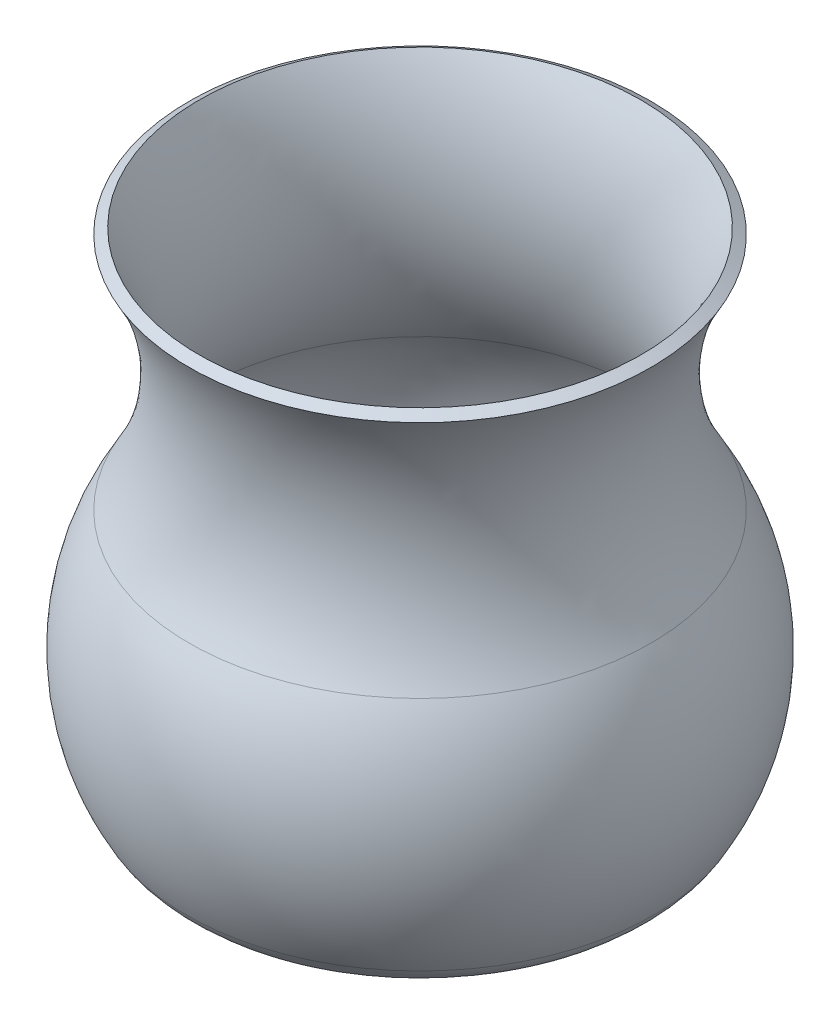
ISO-10303-21;
HEADER;
FILE_DESCRIPTION(('STEP AP214'),'2;1');
FILE_NAME('part.step','',(''),(''),'','','');
FILE_SCHEMA(('AUTOMOTIVE_DESIGN { 1 0 10303 214 1 1 1 1 }'));
ENDSEC;
DATA;
#1=APPLICATION_CONTEXT('core data for automotive mechanical design processes');
#2=APPLICATION_PROTOCOL_DEFINITION('international standard','automotive_design',2000,#1);
#3=PRODUCT_CONTEXT('',#1,'mechanical');
#4=PRODUCT('Part','Part','',(#3));
#5=PRODUCT_RELATED_PRODUCT_CATEGORY('part','',(#4));
#6=PRODUCT_DEFINITION_FORMATION('','',#4);
#7=PRODUCT_DEFINITION_CONTEXT('part definition',#1,'design');
#8=PRODUCT_DEFINITION('design','',#6,#7);
#9=PRODUCT_DEFINITION_SHAPE('','',#8);
#10=(LENGTH_UNIT() NAMED_UNIT(*) SI_UNIT(.MILLI.,.METRE.));
#11=(NAMED_UNIT(*) PLANE_ANGLE_UNIT() SI_UNIT($,.RADIAN.));
#12=(NAMED_UNIT(*) SI_UNIT($,.STERADIAN.) SOLID_ANGLE_UNIT());
#13=UNCERTAINTY_MEASURE_WITH_UNIT(LENGTH_MEASURE(1.E-05),#10,'distance_accuracy_value','');
#14=(GEOMETRIC_REPRESENTATION_CONTEXT(3) GLOBAL_UNCERTAINTY_ASSIGNED_CONTEXT((#13)) GLOBAL_UNIT_ASSIGNED_CONTEXT((#10,
#11,#12)) REPRESENTATION_CONTEXT('',''));
#15=CARTESIAN_POINT('',(0.,0.,0.));
#16=DIRECTION('',(0.,0.,1.));
#17=DIRECTION('',(1.,0.,0.));
#18=AXIS2_PLACEMENT_3D('',#15,#16,#17);
#19=CARTESIAN_POINT('',(0.,49.4766307069672,0.));
#20=DIRECTION('',(0.,-1.,0.));
#21=DIRECTION('',(0.,0.,-1.));
#22=AXIS2_PLACEMENT_3D('',#19,#20,#21);
#23=TOROIDAL_SURFACE('',#22,55.6714823450483,30.);
#24=CARTESIAN_POINT('',(0.,65.,0.));
#25=DIRECTION('',(0.,-1.,0.));
#26=DIRECTION('',(0.,0.,-1.));
#27=AXIS2_PLACEMENT_3D('',#24,#25,#26);
#28=CIRCLE('',#27,30.);
#29=CARTESIAN_POINT('',(0.,65.,-30.));
#30=VERTEX_POINT('',#29);
#31=EDGE_CURVE('E78',#30,#30,#28,.T.);
#32=ORIENTED_EDGE('',*,*,#31,.T.);
#33=EDGE_LOOP('',(#32));
#34=FACE_BOUND('',#33,.T.);
#35=CARTESIAN_POINT('',(0.,33.9532614139343,0.));
#36=DIRECTION('',(0.,-1.,0.));
#37=DIRECTION('',(0.,0.,-1.));
#38=AXIS2_PLACEMENT_3D('',#35,#36,#37);
#39=CIRCLE('',#38,30.);
#40=CARTESIAN_POINT('',(0.,33.9532614139343,-30.));
#41=VERTEX_POINT('',#40);
#42=EDGE_CURVE('E10',#41,#41,#39,.T.);
#43=ORIENTED_EDGE('',*,*,#42,.F.);
#44=EDGE_LOOP('',(#43));
#45=FACE_BOUND('',#44,.T.);
#46=ADVANCED_FACE('F43',(#34,#45),#23,.F.);
#47=CARTESIAN_POINT('',(0.,18.4298921209015,0.));
#48=DIRECTION('',(0.,-1.,0.));
#49=DIRECTION('',(0.,0.,-1.));
#50=AXIS2_PLACEMENT_3D('',#47,#48,#49);
#51=DEGENERATE_TOROIDAL_SURFACE('',#50,4.32851765495172,30.,.T.);
#52=ORIENTED_EDGE('',*,*,#42,.T.);
#53=EDGE_LOOP('',(#52));
#54=FACE_BOUND('',#53,.T.);
#55=CARTESIAN_POINT('',(0.,3.52133718059519,0.));
#56=DIRECTION('',(0.,-1.,0.));
#57=DIRECTION('',(0.,0.,-1.));
#58=AXIS2_PLACEMENT_3D('',#55,#56,#57);
#59=CIRCLE('',#58,30.3618614584639);
#60=CARTESIAN_POINT('',(0.,3.52133718059519,-30.3618614584639));
#61=VERTEX_POINT('',#60);
#62=EDGE_CURVE('E50',#61,#61,#59,.T.);
#63=ORIENTED_EDGE('',*,*,#62,.F.);
#64=EDGE_LOOP('',(#63));
#65=FACE_BOUND('',#64,.T.);
#66=ADVANCED_FACE('F120',(#54,#65),#51,.T.);
#67=CARTESIAN_POINT('',(0.,7.,0.));
#68=DIRECTION('',(0.,-1.,0.));
#69=DIRECTION('',(0.,0.,-1.));
#70=AXIS2_PLACEMENT_3D('',#67,#68,#69);
#71=TOROIDAL_SURFACE('',#70,24.2874145709778,7.);
#72=ORIENTED_EDGE('',*,*,#62,.T.);
#73=EDGE_LOOP('',(#72));
#74=FACE_BOUND('',#73,.T.);
#75=CARTESIAN_POINT('',(0.,0.,0.));
#76=DIRECTION('',(0.,-1.,0.));
#77=DIRECTION('',(0.,0.,-1.));
#78=AXIS2_PLACEMENT_3D('',#75,#76,#77);
#79=CIRCLE('',#78,24.2874145709778);
#80=CARTESIAN_POINT('',(0.,0.,-24.2874145709778));
#81=VERTEX_POINT('',#80);
#82=EDGE_CURVE('E55',#81,#81,#79,.T.);
#83=ORIENTED_EDGE('',*,*,#82,.F.);
#84=EDGE_LOOP('',(#83));
#85=FACE_BOUND('',#84,.T.);
#86=ADVANCED_FACE('F116',(#74,#85),#71,.T.);
#87=CARTESIAN_POINT('',(0.,0.,0.));
#88=DIRECTION('',(0.,-1.,0.));
#89=DIRECTION('',(0.,0.,-1.));
#90=AXIS2_PLACEMENT_3D('',#87,#88,#89);
#91=PLANE('',#90);
#92=ORIENTED_EDGE('',*,*,#82,.T.);
#93=EDGE_LOOP('',(#92));
#94=FACE_BOUND('',#93,.T.);
#95=ADVANCED_FACE('F111',(#94),#91,.T.);
#96=CARTESIAN_POINT('',(0.,1.5,0.));
#97=DIRECTION('',(0.,-1.,0.));
#98=DIRECTION('',(0.,0.,-1.));
#99=AXIS2_PLACEMENT_3D('',#96,#97,#98);
#100=PLANE('',#99);
#101=CARTESIAN_POINT('',(0.,1.5,0.));
#102=DIRECTION('',(0.,-1.,0.));
#103=DIRECTION('',(0.,0.,-1.));
#104=AXIS2_PLACEMENT_3D('',#101,#102,#103);
#105=CIRCLE('',#104,24.2874145709778);
#106=CARTESIAN_POINT('',(0.,1.5,-24.2874145709778));
#107=VERTEX_POINT('',#106);
#108=EDGE_CURVE('E60',#107,#107,#105,.T.);
#109=ORIENTED_EDGE('',*,*,#108,.F.);
#110=EDGE_LOOP('',(#109));
#111=FACE_BOUND('',#110,.T.);
#112=ADVANCED_FACE('F106',(#111),#100,.F.);
#113=CARTESIAN_POINT('',(0.,7.,0.));
#114=DIRECTION('',(0.,-1.,0.));
#115=DIRECTION('',(0.,0.,-1.));
#116=AXIS2_PLACEMENT_3D('',#113,#114,#115);
#117=TOROIDAL_SURFACE('',#116,24.2874145709778,5.5);
#118=CARTESIAN_POINT('',(0.,4.26676492761051,0.));
#119=DIRECTION('',(0.,-1.,0.));
#120=DIRECTION('',(0.,0.,-1.));
#121=AXIS2_PLACEMENT_3D('',#118,#119,#120);
#122=CIRCLE('',#121,29.0601942682883);
#123=CARTESIAN_POINT('',(0.,4.26676492761051,-29.0601942682883));
#124=VERTEX_POINT('',#123);
#125=EDGE_CURVE('E66',#124,#124,#122,.T.);
#126=ORIENTED_EDGE('',*,*,#125,.F.);
#127=EDGE_LOOP('',(#126));
#128=FACE_BOUND('',#127,.T.);
#129=ORIENTED_EDGE('',*,*,#108,.T.);
#130=EDGE_LOOP('',(#129));
#131=FACE_BOUND('',#130,.T.);
#132=ADVANCED_FACE('F100',(#128,#131),#117,.F.);
#133=CARTESIAN_POINT('',(0.,18.4298921209015,0.));
#134=DIRECTION('',(0.,-1.,0.));
#135=DIRECTION('',(0.,0.,-1.));
#136=AXIS2_PLACEMENT_3D('',#133,#134,#135);
#137=DEGENERATE_TOROIDAL_SURFACE('',#136,4.32851765495172,28.5,.T.);
#138=CARTESIAN_POINT('',(0.,33.1770929492827,0.));
#139=DIRECTION('',(0.,-1.,0.));
#140=DIRECTION('',(0.,0.,-1.));
#141=AXIS2_PLACEMENT_3D('',#138,#139,#140);
#142=CIRCLE('',#141,28.7164258827476);
#143=CARTESIAN_POINT('',(0.,33.1770929492827,-28.7164258827476));
#144=VERTEX_POINT('',#143);
#145=EDGE_CURVE('E70',#144,#144,#142,.T.);
#146=ORIENTED_EDGE('',*,*,#145,.F.);
#147=EDGE_LOOP('',(#146));
#148=FACE_BOUND('',#147,.T.);
#149=ORIENTED_EDGE('',*,*,#125,.T.);
#150=EDGE_LOOP('',(#149));
#151=FACE_BOUND('',#150,.T.);
#152=ADVANCED_FACE('F94',(#148,#151),#137,.F.);
#153=CARTESIAN_POINT('',(0.,49.4766307069672,0.));
#154=DIRECTION('',(0.,-1.,0.));
#155=DIRECTION('',(0.,0.,-1.));
#156=AXIS2_PLACEMENT_3D('',#153,#154,#155);
#157=TOROIDAL_SURFACE('',#156,55.6714823450483,31.5);
#158=CARTESIAN_POINT('',(0.,65.7761684646516,0.));
#159=DIRECTION('',(0.,-1.,0.));
#160=DIRECTION('',(0.,0.,-1.));
#161=AXIS2_PLACEMENT_3D('',#158,#159,#160);
#162=CIRCLE('',#161,28.7164258827476);
#163=CARTESIAN_POINT('',(0.,65.7761684646516,-28.7164258827476));
#164=VERTEX_POINT('',#163);
#165=EDGE_CURVE('E74',#164,#164,#162,.T.);
#166=ORIENTED_EDGE('',*,*,#165,.F.);
#167=EDGE_LOOP('',(#166));
#168=FACE_BOUND('',#167,.T.);
#169=ORIENTED_EDGE('',*,*,#145,.T.);
#170=EDGE_LOOP('',(#169));
#171=FACE_BOUND('',#170,.T.);
#172=ADVANCED_FACE('F88',(#168,#171),#157,.T.);
#173=CARTESIAN_POINT('',(0.,65.7761684646516,0.));
#174=DIRECTION('',(0.,-1.,0.));
#175=DIRECTION('',(0.,0.,-1.));
#176=AXIS2_PLACEMENT_3D('',#173,#174,#175);
#177=CONICAL_SURFACE('',#176,28.7164258827476,1.02693313138653);
#178=ORIENTED_EDGE('',*,*,#31,.F.);
#179=EDGE_LOOP('',(#178));
#180=FACE_BOUND('',#179,.T.);
#181=ORIENTED_EDGE('',*,*,#165,.T.);
#182=EDGE_LOOP('',(#181));
#183=FACE_BOUND('',#182,.T.);
#184=ADVANCED_FACE('F85',(#180,#183),#177,.T.);
#185=CLOSED_SHELL('',(#46,#66,#86,#95,#112,#132,#152,#172,#184));
#186=MANIFOLD_SOLID_BREP('B2',#185);
#187=ADVANCED_BREP_SHAPE_REPRESENTATION('',(#18,#186),#14);
#188=SHAPE_DEFINITION_REPRESENTATION(#9,#187);
ENDSEC;
END-ISO-10303-21;
